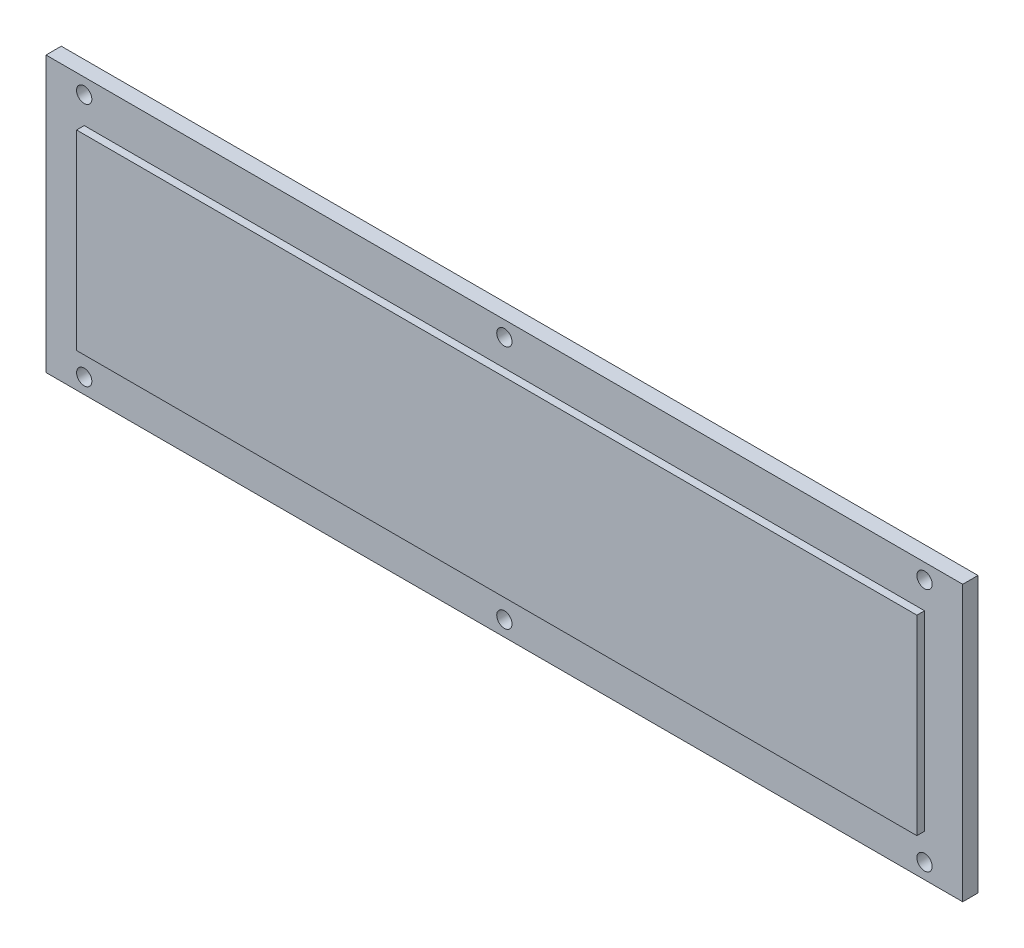
ISO-10303-21;
HEADER;
FILE_DESCRIPTION(('STEP AP214'),'2;1');
FILE_NAME('part.step','',(''),(''),'','','');
FILE_SCHEMA(('AUTOMOTIVE_DESIGN { 1 0 10303 214 1 1 1 1 }'));
ENDSEC;
DATA;
#1=APPLICATION_CONTEXT('core data for automotive mechanical design processes');
#2=APPLICATION_PROTOCOL_DEFINITION('international standard','automotive_design',2000,#1);
#3=PRODUCT_CONTEXT('',#1,'mechanical');
#4=PRODUCT('Part','Part','',(#3));
#5=PRODUCT_RELATED_PRODUCT_CATEGORY('part','',(#4));
#6=PRODUCT_DEFINITION_FORMATION('','',#4);
#7=PRODUCT_DEFINITION_CONTEXT('part definition',#1,'design');
#8=PRODUCT_DEFINITION('design','',#6,#7);
#9=PRODUCT_DEFINITION_SHAPE('','',#8);
#10=(LENGTH_UNIT() NAMED_UNIT(*) SI_UNIT(.MILLI.,.METRE.));
#11=(NAMED_UNIT(*) PLANE_ANGLE_UNIT() SI_UNIT($,.RADIAN.));
#12=(NAMED_UNIT(*) SI_UNIT($,.STERADIAN.) SOLID_ANGLE_UNIT());
#13=UNCERTAINTY_MEASURE_WITH_UNIT(LENGTH_MEASURE(1.E-05),#10,'distance_accuracy_value','');
#14=(GEOMETRIC_REPRESENTATION_CONTEXT(3) GLOBAL_UNCERTAINTY_ASSIGNED_CONTEXT((#13)) GLOBAL_UNIT_ASSIGNED_CONTEXT((#10,
#11,#12)) REPRESENTATION_CONTEXT('',''));
#15=CARTESIAN_POINT('',(0.,0.,0.));
#16=DIRECTION('',(0.,0.,1.));
#17=DIRECTION('',(1.,0.,0.));
#18=AXIS2_PLACEMENT_3D('',#15,#16,#17);
#19=CARTESIAN_POINT('',(60.,18.,2.));
#20=DIRECTION('',(-1.,0.,0.));
#21=DIRECTION('',(0.,0.,1.));
#22=AXIS2_PLACEMENT_3D('',#19,#20,#21);
#23=PLANE('',#22);
#24=DIRECTION('',(0.,1.,0.));
#25=VECTOR('',#24,1.);
#26=CARTESIAN_POINT('',(60.,18.,0.));
#27=LINE('',#26,#25);
#28=CARTESIAN_POINT('',(60.,-18.,0.));
#29=VERTEX_POINT('',#28);
#30=CARTESIAN_POINT('',(60.,18.,0.));
#31=VERTEX_POINT('',#30);
#32=EDGE_CURVE('E120',#29,#31,#27,.T.);
#33=ORIENTED_EDGE('',*,*,#32,.T.);
#34=DIRECTION('',(0.,0.,-1.));
#35=VECTOR('',#34,1.);
#36=CARTESIAN_POINT('',(60.,18.,2.));
#37=LINE('',#36,#35);
#38=CARTESIAN_POINT('',(60.,18.,2.));
#39=VERTEX_POINT('',#38);
#40=EDGE_CURVE('E11',#39,#31,#37,.T.);
#41=ORIENTED_EDGE('',*,*,#40,.F.);
#42=DIRECTION('',(0.,1.,0.));
#43=VECTOR('',#42,1.);
#44=CARTESIAN_POINT('',(60.,18.,2.));
#45=LINE('',#44,#43);
#46=CARTESIAN_POINT('',(60.,-18.,2.));
#47=VERTEX_POINT('',#46);
#48=EDGE_CURVE('E129',#47,#39,#45,.T.);
#49=ORIENTED_EDGE('',*,*,#48,.F.);
#50=DIRECTION('',(0.,0.,-1.));
#51=VECTOR('',#50,1.);
#52=CARTESIAN_POINT('',(60.,-18.,2.));
#53=LINE('',#52,#51);
#54=EDGE_CURVE('E138',#47,#29,#53,.T.);
#55=ORIENTED_EDGE('',*,*,#54,.T.);
#56=EDGE_LOOP('',(#33,#41,#49,#55));
#57=FACE_BOUND('',#56,.T.);
#58=ADVANCED_FACE('F36',(#57),#23,.F.);
#59=CARTESIAN_POINT('',(-60.,18.,2.));
#60=DIRECTION('',(0.,-1.,0.));
#61=DIRECTION('',(0.,0.,-1.));
#62=AXIS2_PLACEMENT_3D('',#59,#60,#61);
#63=PLANE('',#62);
#64=DIRECTION('',(-1.,0.,0.));
#65=VECTOR('',#64,1.);
#66=CARTESIAN_POINT('',(-60.,18.,0.));
#67=LINE('',#66,#65);
#68=CARTESIAN_POINT('',(-60.,18.,0.));
#69=VERTEX_POINT('',#68);
#70=EDGE_CURVE('E123',#31,#69,#67,.T.);
#71=ORIENTED_EDGE('',*,*,#70,.T.);
#72=DIRECTION('',(0.,0.,-1.));
#73=VECTOR('',#72,1.);
#74=CARTESIAN_POINT('',(-60.,18.,2.));
#75=LINE('',#74,#73);
#76=CARTESIAN_POINT('',(-60.,18.,2.));
#77=VERTEX_POINT('',#76);
#78=EDGE_CURVE('E43',#77,#69,#75,.T.);
#79=ORIENTED_EDGE('',*,*,#78,.F.);
#80=DIRECTION('',(-1.,0.,0.));
#81=VECTOR('',#80,1.);
#82=CARTESIAN_POINT('',(-60.,18.,2.));
#83=LINE('',#82,#81);
#84=EDGE_CURVE('E132',#39,#77,#83,.T.);
#85=ORIENTED_EDGE('',*,*,#84,.F.);
#86=ORIENTED_EDGE('',*,*,#40,.T.);
#87=EDGE_LOOP('',(#71,#79,#85,#86));
#88=FACE_BOUND('',#87,.T.);
#89=ADVANCED_FACE('F169',(#88),#63,.F.);
#90=CARTESIAN_POINT('',(-60.,18.,2.));
#91=DIRECTION('',(1.,0.,0.));
#92=DIRECTION('',(0.,0.,-1.));
#93=AXIS2_PLACEMENT_3D('',#90,#91,#92);
#94=PLANE('',#93);
#95=DIRECTION('',(0.,-1.,0.));
#96=VECTOR('',#95,1.);
#97=CARTESIAN_POINT('',(-60.,18.,0.));
#98=LINE('',#97,#96);
#99=CARTESIAN_POINT('',(-60.,-18.,0.));
#100=VERTEX_POINT('',#99);
#101=EDGE_CURVE('E141',#69,#100,#98,.T.);
#102=ORIENTED_EDGE('',*,*,#101,.T.);
#103=DIRECTION('',(0.,0.,-1.));
#104=VECTOR('',#103,1.);
#105=CARTESIAN_POINT('',(-60.,-18.,2.));
#106=LINE('',#105,#104);
#107=CARTESIAN_POINT('',(-60.,-18.,2.));
#108=VERTEX_POINT('',#107);
#109=EDGE_CURVE('E146',#108,#100,#106,.T.);
#110=ORIENTED_EDGE('',*,*,#109,.F.);
#111=DIRECTION('',(0.,-1.,0.));
#112=VECTOR('',#111,1.);
#113=CARTESIAN_POINT('',(-60.,18.,2.));
#114=LINE('',#113,#112);
#115=EDGE_CURVE('E135',#77,#108,#114,.T.);
#116=ORIENTED_EDGE('',*,*,#115,.F.);
#117=ORIENTED_EDGE('',*,*,#78,.T.);
#118=EDGE_LOOP('',(#102,#110,#116,#117));
#119=FACE_BOUND('',#118,.T.);
#120=ADVANCED_FACE('F153',(#119),#94,.F.);
#121=CARTESIAN_POINT('',(-60.,-18.,2.));
#122=DIRECTION('',(0.,1.,0.));
#123=DIRECTION('',(0.,0.,1.));
#124=AXIS2_PLACEMENT_3D('',#121,#122,#123);
#125=PLANE('',#124);
#126=DIRECTION('',(1.,0.,0.));
#127=VECTOR('',#126,1.);
#128=CARTESIAN_POINT('',(-60.,-18.,0.));
#129=LINE('',#128,#127);
#130=EDGE_CURVE('E133',#100,#29,#129,.T.);
#131=ORIENTED_EDGE('',*,*,#130,.T.);
#132=ORIENTED_EDGE('',*,*,#54,.F.);
#133=DIRECTION('',(1.,0.,0.));
#134=VECTOR('',#133,1.);
#135=CARTESIAN_POINT('',(-60.,-18.,2.));
#136=LINE('',#135,#134);
#137=EDGE_CURVE('E137',#108,#47,#136,.T.);
#138=ORIENTED_EDGE('',*,*,#137,.F.);
#139=ORIENTED_EDGE('',*,*,#109,.T.);
#140=EDGE_LOOP('',(#131,#132,#138,#139));
#141=FACE_BOUND('',#140,.T.);
#142=ADVANCED_FACE('F162',(#141),#125,.F.);
#143=CARTESIAN_POINT('',(0.,0.,2.));
#144=DIRECTION('',(0.,0.,1.));
#145=DIRECTION('',(1.,0.,0.));
#146=AXIS2_PLACEMENT_3D('',#143,#144,#145);
#147=PLANE('',#146);
#148=CARTESIAN_POINT('',(0.,16.,2.));
#149=DIRECTION('',(0.,0.,1.));
#150=DIRECTION('',(1.,0.,0.));
#151=AXIS2_PLACEMENT_3D('',#148,#149,#150);
#152=CIRCLE('',#151,1.);
#153=CARTESIAN_POINT('',(0.999999999999987,16.,2.));
#154=VERTEX_POINT('',#153);
#155=EDGE_CURVE('E227',#154,#154,#152,.T.);
#156=ORIENTED_EDGE('',*,*,#155,.F.);
#157=EDGE_LOOP('',(#156));
#158=FACE_BOUND('',#157,.T.);
#159=CARTESIAN_POINT('',(0.,-16.,2.));
#160=DIRECTION('',(0.,0.,1.));
#161=DIRECTION('',(1.,0.,0.));
#162=AXIS2_PLACEMENT_3D('',#159,#160,#161);
#163=CIRCLE('',#162,1.);
#164=CARTESIAN_POINT('',(0.999999999999986,-16.,2.));
#165=VERTEX_POINT('',#164);
#166=EDGE_CURVE('E231',#165,#165,#163,.T.);
#167=ORIENTED_EDGE('',*,*,#166,.F.);
#168=EDGE_LOOP('',(#167));
#169=FACE_BOUND('',#168,.T.);
#170=CARTESIAN_POINT('',(-55.,-16.,2.));
#171=DIRECTION('',(0.,0.,1.));
#172=DIRECTION('',(1.,0.,0.));
#173=AXIS2_PLACEMENT_3D('',#170,#171,#172);
#174=CIRCLE('',#173,0.999999999999998);
#175=CARTESIAN_POINT('',(-54.,-16.,2.));
#176=VERTEX_POINT('',#175);
#177=EDGE_CURVE('E251',#176,#176,#174,.T.);
#178=ORIENTED_EDGE('',*,*,#177,.F.);
#179=EDGE_LOOP('',(#178));
#180=FACE_BOUND('',#179,.T.);
#181=CARTESIAN_POINT('',(55.,16.,2.));
#182=DIRECTION('',(0.,0.,1.));
#183=DIRECTION('',(1.,0.,0.));
#184=AXIS2_PLACEMENT_3D('',#181,#182,#183);
#185=CIRCLE('',#184,0.999999999999998);
#186=CARTESIAN_POINT('',(56.,16.,2.));
#187=VERTEX_POINT('',#186);
#188=EDGE_CURVE('E244',#187,#187,#185,.T.);
#189=ORIENTED_EDGE('',*,*,#188,.F.);
#190=EDGE_LOOP('',(#189));
#191=FACE_BOUND('',#190,.T.);
#192=CARTESIAN_POINT('',(55.,-16.,2.));
#193=DIRECTION('',(0.,0.,1.));
#194=DIRECTION('',(1.,0.,0.));
#195=AXIS2_PLACEMENT_3D('',#192,#193,#194);
#196=CIRCLE('',#195,0.999999999999998);
#197=CARTESIAN_POINT('',(56.,-16.,2.));
#198=VERTEX_POINT('',#197);
#199=EDGE_CURVE('E240',#198,#198,#196,.T.);
#200=ORIENTED_EDGE('',*,*,#199,.F.);
#201=EDGE_LOOP('',(#200));
#202=FACE_BOUND('',#201,.T.);
#203=CARTESIAN_POINT('',(-55.,16.,2.));
#204=DIRECTION('',(0.,0.,1.));
#205=DIRECTION('',(1.,0.,0.));
#206=AXIS2_PLACEMENT_3D('',#203,#204,#205);
#207=CIRCLE('',#206,0.999999999999998);
#208=CARTESIAN_POINT('',(-54.,16.,2.));
#209=VERTEX_POINT('',#208);
#210=EDGE_CURVE('E250',#209,#209,#207,.T.);
#211=ORIENTED_EDGE('',*,*,#210,.F.);
#212=EDGE_LOOP('',(#211));
#213=FACE_BOUND('',#212,.T.);
#214=DIRECTION('',(0.,1.,0.));
#215=VECTOR('',#214,1.);
#216=CARTESIAN_POINT('',(55.,12.5,2.));
#217=LINE('',#216,#215);
#218=CARTESIAN_POINT('',(55.,-12.5,2.));
#219=VERTEX_POINT('',#218);
#220=CARTESIAN_POINT('',(55.,12.5,2.));
#221=VERTEX_POINT('',#220);
#222=EDGE_CURVE('E50',#219,#221,#217,.T.);
#223=ORIENTED_EDGE('',*,*,#222,.F.);
#224=DIRECTION('',(1.,0.,0.));
#225=VECTOR('',#224,1.);
#226=CARTESIAN_POINT('',(-55.,-12.5,2.));
#227=LINE('',#226,#225);
#228=CARTESIAN_POINT('',(-55.,-12.5,2.));
#229=VERTEX_POINT('',#228);
#230=EDGE_CURVE('E54',#229,#219,#227,.T.);
#231=ORIENTED_EDGE('',*,*,#230,.F.);
#232=DIRECTION('',(0.,-1.,0.));
#233=VECTOR('',#232,1.);
#234=CARTESIAN_POINT('',(-55.,12.5,2.));
#235=LINE('',#234,#233);
#236=CARTESIAN_POINT('',(-55.,12.5,2.));
#237=VERTEX_POINT('',#236);
#238=EDGE_CURVE('E270',#237,#229,#235,.T.);
#239=ORIENTED_EDGE('',*,*,#238,.F.);
#240=DIRECTION('',(-1.,0.,0.));
#241=VECTOR('',#240,1.);
#242=CARTESIAN_POINT('',(-55.,12.5,2.));
#243=LINE('',#242,#241);
#244=EDGE_CURVE('E268',#221,#237,#243,.T.);
#245=ORIENTED_EDGE('',*,*,#244,.F.);
#246=EDGE_LOOP('',(#223,#231,#239,#245));
#247=FACE_BOUND('',#246,.T.);
#248=ORIENTED_EDGE('',*,*,#48,.T.);
#249=ORIENTED_EDGE('',*,*,#84,.T.);
#250=ORIENTED_EDGE('',*,*,#115,.T.);
#251=ORIENTED_EDGE('',*,*,#137,.T.);
#252=EDGE_LOOP('',(#248,#249,#250,#251));
#253=FACE_BOUND('',#252,.T.);
#254=ADVANCED_FACE('F168',(#158,#169,#180,#191,#202,#213,#247,#253),#147,.T.);
#255=CARTESIAN_POINT('',(0.,0.,0.));
#256=DIRECTION('',(0.,0.,1.));
#257=DIRECTION('',(1.,0.,0.));
#258=AXIS2_PLACEMENT_3D('',#255,#256,#257);
#259=PLANE('',#258);
#260=CARTESIAN_POINT('',(0.,16.,0.));
#261=DIRECTION('',(0.,0.,-1.));
#262=DIRECTION('',(-1.,0.,0.));
#263=AXIS2_PLACEMENT_3D('',#260,#261,#262);
#264=CIRCLE('',#263,1.);
#265=CARTESIAN_POINT('',(-1.00000000000001,16.,0.));
#266=VERTEX_POINT('',#265);
#267=EDGE_CURVE('E230',#266,#266,#264,.T.);
#268=ORIENTED_EDGE('',*,*,#267,.F.);
#269=EDGE_LOOP('',(#268));
#270=FACE_BOUND('',#269,.T.);
#271=CARTESIAN_POINT('',(0.,-16.,0.));
#272=DIRECTION('',(0.,0.,-1.));
#273=DIRECTION('',(-1.,0.,0.));
#274=AXIS2_PLACEMENT_3D('',#271,#272,#273);
#275=CIRCLE('',#274,1.);
#276=CARTESIAN_POINT('',(-1.00000000000001,-16.,0.));
#277=VERTEX_POINT('',#276);
#278=EDGE_CURVE('E232',#277,#277,#275,.T.);
#279=ORIENTED_EDGE('',*,*,#278,.F.);
#280=EDGE_LOOP('',(#279));
#281=FACE_BOUND('',#280,.T.);
#282=CARTESIAN_POINT('',(-55.,-16.,0.));
#283=DIRECTION('',(0.,0.,1.));
#284=DIRECTION('',(1.,0.,0.));
#285=AXIS2_PLACEMENT_3D('',#282,#283,#284);
#286=CIRCLE('',#285,0.999999999999998);
#287=CARTESIAN_POINT('',(-54.,-16.,0.));
#288=VERTEX_POINT('',#287);
#289=EDGE_CURVE('E247',#288,#288,#286,.T.);
#290=ORIENTED_EDGE('',*,*,#289,.T.);
#291=EDGE_LOOP('',(#290));
#292=FACE_BOUND('',#291,.T.);
#293=CARTESIAN_POINT('',(55.,16.,0.));
#294=DIRECTION('',(0.,0.,1.));
#295=DIRECTION('',(1.,0.,0.));
#296=AXIS2_PLACEMENT_3D('',#293,#294,#295);
#297=CIRCLE('',#296,0.999999999999998);
#298=CARTESIAN_POINT('',(56.,16.,0.));
#299=VERTEX_POINT('',#298);
#300=EDGE_CURVE('E254',#299,#299,#297,.T.);
#301=ORIENTED_EDGE('',*,*,#300,.T.);
#302=EDGE_LOOP('',(#301));
#303=FACE_BOUND('',#302,.T.);
#304=CARTESIAN_POINT('',(55.,-16.,0.));
#305=DIRECTION('',(0.,0.,1.));
#306=DIRECTION('',(1.,0.,0.));
#307=AXIS2_PLACEMENT_3D('',#304,#305,#306);
#308=CIRCLE('',#307,0.999999999999998);
#309=CARTESIAN_POINT('',(56.,-16.,0.));
#310=VERTEX_POINT('',#309);
#311=EDGE_CURVE('E241',#310,#310,#308,.T.);
#312=ORIENTED_EDGE('',*,*,#311,.T.);
#313=EDGE_LOOP('',(#312));
#314=FACE_BOUND('',#313,.T.);
#315=CARTESIAN_POINT('',(-55.,16.,0.));
#316=DIRECTION('',(0.,0.,1.));
#317=DIRECTION('',(1.,0.,0.));
#318=AXIS2_PLACEMENT_3D('',#315,#316,#317);
#319=CIRCLE('',#318,0.999999999999998);
#320=CARTESIAN_POINT('',(-54.,16.,0.));
#321=VERTEX_POINT('',#320);
#322=EDGE_CURVE('E259',#321,#321,#319,.T.);
#323=ORIENTED_EDGE('',*,*,#322,.T.);
#324=EDGE_LOOP('',(#323));
#325=FACE_BOUND('',#324,.T.);
#326=ORIENTED_EDGE('',*,*,#32,.F.);
#327=ORIENTED_EDGE('',*,*,#130,.F.);
#328=ORIENTED_EDGE('',*,*,#101,.F.);
#329=ORIENTED_EDGE('',*,*,#70,.F.);
#330=EDGE_LOOP('',(#326,#327,#328,#329));
#331=FACE_BOUND('',#330,.T.);
#332=ADVANCED_FACE('F159',(#270,#281,#292,#303,#314,#325,#331),#259,.F.);
#333=CARTESIAN_POINT('',(55.,12.5,3.));
#334=DIRECTION('',(-1.,0.,0.));
#335=DIRECTION('',(0.,0.,1.));
#336=AXIS2_PLACEMENT_3D('',#333,#334,#335);
#337=PLANE('',#336);
#338=ORIENTED_EDGE('',*,*,#222,.T.);
#339=DIRECTION('',(0.,0.,-1.));
#340=VECTOR('',#339,1.);
#341=CARTESIAN_POINT('',(55.,12.5,3.));
#342=LINE('',#341,#340);
#343=CARTESIAN_POINT('',(55.,12.5,3.));
#344=VERTEX_POINT('',#343);
#345=EDGE_CURVE('E103',#344,#221,#342,.T.);
#346=ORIENTED_EDGE('',*,*,#345,.F.);
#347=DIRECTION('',(0.,1.,0.));
#348=VECTOR('',#347,1.);
#349=CARTESIAN_POINT('',(55.,12.5,3.));
#350=LINE('',#349,#348);
#351=CARTESIAN_POINT('',(55.,-12.5,3.));
#352=VERTEX_POINT('',#351);
#353=EDGE_CURVE('E109',#352,#344,#350,.T.);
#354=ORIENTED_EDGE('',*,*,#353,.F.);
#355=DIRECTION('',(0.,0.,-1.));
#356=VECTOR('',#355,1.);
#357=CARTESIAN_POINT('',(55.,-12.5,3.));
#358=LINE('',#357,#356);
#359=EDGE_CURVE('E266',#352,#219,#358,.T.);
#360=ORIENTED_EDGE('',*,*,#359,.T.);
#361=EDGE_LOOP('',(#338,#346,#354,#360));
#362=FACE_BOUND('',#361,.T.);
#363=ADVANCED_FACE('F119',(#362),#337,.F.);
#364=CARTESIAN_POINT('',(-55.,12.5,3.));
#365=DIRECTION('',(0.,-1.,0.));
#366=DIRECTION('',(0.,0.,-1.));
#367=AXIS2_PLACEMENT_3D('',#364,#365,#366);
#368=PLANE('',#367);
#369=ORIENTED_EDGE('',*,*,#244,.T.);
#370=DIRECTION('',(0.,0.,-1.));
#371=VECTOR('',#370,1.);
#372=CARTESIAN_POINT('',(-55.,12.5,3.));
#373=LINE('',#372,#371);
#374=CARTESIAN_POINT('',(-55.,12.5,3.));
#375=VERTEX_POINT('',#374);
#376=EDGE_CURVE('E105',#375,#237,#373,.T.);
#377=ORIENTED_EDGE('',*,*,#376,.F.);
#378=DIRECTION('',(-1.,0.,0.));
#379=VECTOR('',#378,1.);
#380=CARTESIAN_POINT('',(-55.,12.5,3.));
#381=LINE('',#380,#379);
#382=EDGE_CURVE('E98',#344,#375,#381,.T.);
#383=ORIENTED_EDGE('',*,*,#382,.F.);
#384=ORIENTED_EDGE('',*,*,#345,.T.);
#385=EDGE_LOOP('',(#369,#377,#383,#384));
#386=FACE_BOUND('',#385,.T.);
#387=ADVANCED_FACE('F101',(#386),#368,.F.);
#388=CARTESIAN_POINT('',(-55.,12.5,3.));
#389=DIRECTION('',(1.,0.,0.));
#390=DIRECTION('',(0.,0.,-1.));
#391=AXIS2_PLACEMENT_3D('',#388,#389,#390);
#392=PLANE('',#391);
#393=ORIENTED_EDGE('',*,*,#238,.T.);
#394=DIRECTION('',(0.,0.,-1.));
#395=VECTOR('',#394,1.);
#396=CARTESIAN_POINT('',(-55.,-12.5,3.));
#397=LINE('',#396,#395);
#398=CARTESIAN_POINT('',(-55.,-12.5,3.));
#399=VERTEX_POINT('',#398);
#400=EDGE_CURVE('E125',#399,#229,#397,.T.);
#401=ORIENTED_EDGE('',*,*,#400,.F.);
#402=DIRECTION('',(0.,-1.,0.));
#403=VECTOR('',#402,1.);
#404=CARTESIAN_POINT('',(-55.,12.5,3.));
#405=LINE('',#404,#403);
#406=EDGE_CURVE('E108',#375,#399,#405,.T.);
#407=ORIENTED_EDGE('',*,*,#406,.F.);
#408=ORIENTED_EDGE('',*,*,#376,.T.);
#409=EDGE_LOOP('',(#393,#401,#407,#408));
#410=FACE_BOUND('',#409,.T.);
#411=ADVANCED_FACE('F189',(#410),#392,.F.);
#412=CARTESIAN_POINT('',(-55.,-12.5,3.));
#413=DIRECTION('',(0.,1.,0.));
#414=DIRECTION('',(0.,0.,1.));
#415=AXIS2_PLACEMENT_3D('',#412,#413,#414);
#416=PLANE('',#415);
#417=ORIENTED_EDGE('',*,*,#230,.T.);
#418=ORIENTED_EDGE('',*,*,#359,.F.);
#419=DIRECTION('',(1.,0.,0.));
#420=VECTOR('',#419,1.);
#421=CARTESIAN_POINT('',(-55.,-12.5,3.));
#422=LINE('',#421,#420);
#423=EDGE_CURVE('E114',#399,#352,#422,.T.);
#424=ORIENTED_EDGE('',*,*,#423,.F.);
#425=ORIENTED_EDGE('',*,*,#400,.T.);
#426=EDGE_LOOP('',(#417,#418,#424,#425));
#427=FACE_BOUND('',#426,.T.);
#428=ADVANCED_FACE('F192',(#427),#416,.F.);
#429=CARTESIAN_POINT('',(0.,0.,3.));
#430=DIRECTION('',(0.,0.,1.));
#431=DIRECTION('',(1.,0.,0.));
#432=AXIS2_PLACEMENT_3D('',#429,#430,#431);
#433=PLANE('',#432);
#434=ORIENTED_EDGE('',*,*,#353,.T.);
#435=ORIENTED_EDGE('',*,*,#382,.T.);
#436=ORIENTED_EDGE('',*,*,#406,.T.);
#437=ORIENTED_EDGE('',*,*,#423,.T.);
#438=EDGE_LOOP('',(#434,#435,#436,#437));
#439=FACE_BOUND('',#438,.T.);
#440=ADVANCED_FACE('F112',(#439),#433,.T.);
#441=CARTESIAN_POINT('',(-55.,16.,0.));
#442=DIRECTION('',(0.,0.,1.));
#443=DIRECTION('',(1.,0.,0.));
#444=AXIS2_PLACEMENT_3D('',#441,#442,#443);
#445=CYLINDRICAL_SURFACE('',#444,0.999999999999998);
#446=ORIENTED_EDGE('',*,*,#322,.F.);
#447=EDGE_LOOP('',(#446));
#448=FACE_BOUND('',#447,.T.);
#449=ORIENTED_EDGE('',*,*,#210,.T.);
#450=EDGE_LOOP('',(#449));
#451=FACE_BOUND('',#450,.T.);
#452=ADVANCED_FACE('F199',(#448,#451),#445,.F.);
#453=CARTESIAN_POINT('',(55.,-16.,0.));
#454=DIRECTION('',(0.,0.,1.));
#455=DIRECTION('',(1.,0.,0.));
#456=AXIS2_PLACEMENT_3D('',#453,#454,#455);
#457=CYLINDRICAL_SURFACE('',#456,0.999999999999998);
#458=ORIENTED_EDGE('',*,*,#311,.F.);
#459=EDGE_LOOP('',(#458));
#460=FACE_BOUND('',#459,.T.);
#461=ORIENTED_EDGE('',*,*,#199,.T.);
#462=EDGE_LOOP('',(#461));
#463=FACE_BOUND('',#462,.T.);
#464=ADVANCED_FACE('F202',(#460,#463),#457,.F.);
#465=CARTESIAN_POINT('',(55.,16.,0.));
#466=DIRECTION('',(0.,0.,1.));
#467=DIRECTION('',(1.,0.,0.));
#468=AXIS2_PLACEMENT_3D('',#465,#466,#467);
#469=CYLINDRICAL_SURFACE('',#468,0.999999999999998);
#470=ORIENTED_EDGE('',*,*,#300,.F.);
#471=EDGE_LOOP('',(#470));
#472=FACE_BOUND('',#471,.T.);
#473=ORIENTED_EDGE('',*,*,#188,.T.);
#474=EDGE_LOOP('',(#473));
#475=FACE_BOUND('',#474,.T.);
#476=ADVANCED_FACE('F204',(#472,#475),#469,.F.);
#477=CARTESIAN_POINT('',(-55.,-16.,0.));
#478=DIRECTION('',(0.,0.,1.));
#479=DIRECTION('',(1.,0.,0.));
#480=AXIS2_PLACEMENT_3D('',#477,#478,#479);
#481=CYLINDRICAL_SURFACE('',#480,0.999999999999998);
#482=ORIENTED_EDGE('',*,*,#289,.F.);
#483=EDGE_LOOP('',(#482));
#484=FACE_BOUND('',#483,.T.);
#485=ORIENTED_EDGE('',*,*,#177,.T.);
#486=EDGE_LOOP('',(#485));
#487=FACE_BOUND('',#486,.T.);
#488=ADVANCED_FACE('F207',(#484,#487),#481,.F.);
#489=CARTESIAN_POINT('',(0.,-16.,10.));
#490=DIRECTION('',(0.,0.,-1.));
#491=DIRECTION('',(-1.,0.,0.));
#492=AXIS2_PLACEMENT_3D('',#489,#490,#491);
#493=CYLINDRICAL_SURFACE('',#492,1.);
#494=ORIENTED_EDGE('',*,*,#166,.T.);
#495=EDGE_LOOP('',(#494));
#496=FACE_BOUND('',#495,.T.);
#497=ORIENTED_EDGE('',*,*,#278,.T.);
#498=EDGE_LOOP('',(#497));
#499=FACE_BOUND('',#498,.T.);
#500=ADVANCED_FACE('F211',(#496,#499),#493,.F.);
#501=CARTESIAN_POINT('',(0.,16.,10.));
#502=DIRECTION('',(0.,0.,-1.));
#503=DIRECTION('',(-1.,0.,0.));
#504=AXIS2_PLACEMENT_3D('',#501,#502,#503);
#505=CYLINDRICAL_SURFACE('',#504,1.);
#506=ORIENTED_EDGE('',*,*,#155,.T.);
#507=EDGE_LOOP('',(#506));
#508=FACE_BOUND('',#507,.T.);
#509=ORIENTED_EDGE('',*,*,#267,.T.);
#510=EDGE_LOOP('',(#509));
#511=FACE_BOUND('',#510,.T.);
#512=ADVANCED_FACE('F218',(#508,#511),#505,.F.);
#513=CLOSED_SHELL('',(#58,#89,#120,#142,#254,#332,#363,#387,#411,#428,#440,#452,#464,#476,#488,
#500,#512));
#514=MANIFOLD_SOLID_BREP('B2',#513);
#515=ADVANCED_BREP_SHAPE_REPRESENTATION('',(#18,#514),#14);
#516=SHAPE_DEFINITION_REPRESENTATION(#9,#515);
ENDSEC;
END-ISO-10303-21;
